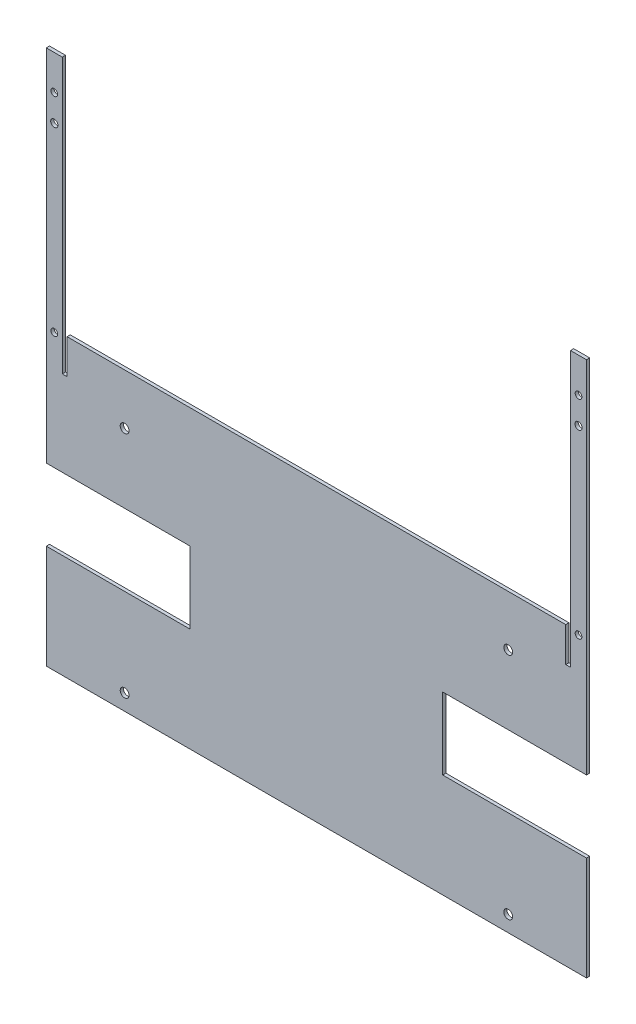
ISO-10303-21;
HEADER;
FILE_DESCRIPTION(('STEP AP214'),'2;1');
FILE_NAME('part.step','',(''),(''),'','','');
FILE_SCHEMA(('AUTOMOTIVE_DESIGN { 1 0 10303 214 1 1 1 1 }'));
ENDSEC;
DATA;
#1=APPLICATION_CONTEXT('core data for automotive mechanical design processes');
#2=APPLICATION_PROTOCOL_DEFINITION('international standard','automotive_design',2000,#1);
#3=PRODUCT_CONTEXT('',#1,'mechanical');
#4=PRODUCT('Part','Part','',(#3));
#5=PRODUCT_RELATED_PRODUCT_CATEGORY('part','',(#4));
#6=PRODUCT_DEFINITION_FORMATION('','',#4);
#7=PRODUCT_DEFINITION_CONTEXT('part definition',#1,'design');
#8=PRODUCT_DEFINITION('design','',#6,#7);
#9=PRODUCT_DEFINITION_SHAPE('','',#8);
#10=(LENGTH_UNIT() NAMED_UNIT(*) SI_UNIT(.MILLI.,.METRE.));
#11=(NAMED_UNIT(*) PLANE_ANGLE_UNIT() SI_UNIT($,.RADIAN.));
#12=(NAMED_UNIT(*) SI_UNIT($,.STERADIAN.) SOLID_ANGLE_UNIT());
#13=UNCERTAINTY_MEASURE_WITH_UNIT(LENGTH_MEASURE(1.E-05),#10,'distance_accuracy_value','');
#14=(GEOMETRIC_REPRESENTATION_CONTEXT(3) GLOBAL_UNCERTAINTY_ASSIGNED_CONTEXT((#13)) GLOBAL_UNIT_ASSIGNED_CONTEXT((#10,
#11,#12)) REPRESENTATION_CONTEXT('',''));
#15=CARTESIAN_POINT('',(0.,0.,0.));
#16=DIRECTION('',(0.,0.,1.));
#17=DIRECTION('',(1.,0.,0.));
#18=AXIS2_PLACEMENT_3D('',#15,#16,#17);
#19=CARTESIAN_POINT('',(-169.,-167.5,2.));
#20=DIRECTION('',(1.,0.,0.));
#21=DIRECTION('',(0.,0.,-1.));
#22=AXIS2_PLACEMENT_3D('',#19,#20,#21);
#23=PLANE('',#22);
#24=DIRECTION('',(0.,-1.,0.));
#25=VECTOR('',#24,1.);
#26=CARTESIAN_POINT('',(-169.,-167.5,2.));
#27=LINE('',#26,#25);
#28=CARTESIAN_POINT('',(-169.,-102.5,2.));
#29=VERTEX_POINT('',#28);
#30=CARTESIAN_POINT('',(-169.,-167.5,2.));
#31=VERTEX_POINT('',#30);
#32=EDGE_CURVE('E310',#29,#31,#27,.T.);
#33=ORIENTED_EDGE('',*,*,#32,.F.);
#34=DIRECTION('',(0.,0.,1.));
#35=VECTOR('',#34,1.);
#36=CARTESIAN_POINT('',(-169.,-102.5,0.));
#37=LINE('',#36,#35);
#38=CARTESIAN_POINT('',(-169.,-102.5,0.));
#39=VERTEX_POINT('',#38);
#40=EDGE_CURVE('E250',#39,#29,#37,.T.);
#41=ORIENTED_EDGE('',*,*,#40,.F.);
#42=DIRECTION('',(0.,-1.,0.));
#43=VECTOR('',#42,1.);
#44=CARTESIAN_POINT('',(-169.,-167.5,0.));
#45=LINE('',#44,#43);
#46=CARTESIAN_POINT('',(-169.,-167.5,0.));
#47=VERTEX_POINT('',#46);
#48=EDGE_CURVE('E324',#39,#47,#45,.T.);
#49=ORIENTED_EDGE('',*,*,#48,.T.);
#50=DIRECTION('',(0.,0.,-1.));
#51=VECTOR('',#50,1.);
#52=CARTESIAN_POINT('',(-169.,-167.5,2.));
#53=LINE('',#52,#51);
#54=EDGE_CURVE('E332',#31,#47,#53,.T.);
#55=ORIENTED_EDGE('',*,*,#54,.F.);
#56=EDGE_LOOP('',(#33,#41,#49,#55));
#57=FACE_BOUND('',#56,.T.);
#58=ADVANCED_FACE('F33',(#57),#23,.F.);
#59=CARTESIAN_POINT('',(-169.,167.5,2.));
#60=DIRECTION('',(0.,-1.,0.));
#61=DIRECTION('',(0.,0.,-1.));
#62=AXIS2_PLACEMENT_3D('',#59,#60,#61);
#63=PLANE('',#62);
#64=DIRECTION('',(-1.,0.,0.));
#65=VECTOR('',#64,1.);
#66=CARTESIAN_POINT('',(-169.,167.5,0.));
#67=LINE('',#66,#65);
#68=CARTESIAN_POINT('',(169.,167.5,0.));
#69=VERTEX_POINT('',#68);
#70=CARTESIAN_POINT('',(159.,167.5,0.));
#71=VERTEX_POINT('',#70);
#72=EDGE_CURVE('E321',#69,#71,#67,.T.);
#73=ORIENTED_EDGE('',*,*,#72,.T.);
#74=DIRECTION('',(0.,0.,1.));
#75=VECTOR('',#74,1.);
#76=CARTESIAN_POINT('',(159.,167.5,0.));
#77=LINE('',#76,#75);
#78=CARTESIAN_POINT('',(159.,167.5,2.));
#79=VERTEX_POINT('',#78);
#80=EDGE_CURVE('E265',#71,#79,#77,.T.);
#81=ORIENTED_EDGE('',*,*,#80,.T.);
#82=DIRECTION('',(-1.,0.,0.));
#83=VECTOR('',#82,1.);
#84=CARTESIAN_POINT('',(-169.,167.5,2.));
#85=LINE('',#84,#83);
#86=CARTESIAN_POINT('',(169.,167.5,2.));
#87=VERTEX_POINT('',#86);
#88=EDGE_CURVE('E307',#87,#79,#85,.T.);
#89=ORIENTED_EDGE('',*,*,#88,.F.);
#90=DIRECTION('',(0.,0.,-1.));
#91=VECTOR('',#90,1.);
#92=CARTESIAN_POINT('',(169.,167.5,2.));
#93=LINE('',#92,#91);
#94=EDGE_CURVE('E11',#87,#69,#93,.T.);
#95=ORIENTED_EDGE('',*,*,#94,.T.);
#96=EDGE_LOOP('',(#73,#81,#89,#95));
#97=FACE_BOUND('',#96,.T.);
#98=ADVANCED_FACE('F375',(#97),#63,.F.);
#99=CARTESIAN_POINT('',(169.,-167.5,2.));
#100=DIRECTION('',(-1.,0.,0.));
#101=DIRECTION('',(0.,0.,1.));
#102=AXIS2_PLACEMENT_3D('',#99,#100,#101);
#103=PLANE('',#102);
#104=DIRECTION('',(0.,1.,0.));
#105=VECTOR('',#104,1.);
#106=CARTESIAN_POINT('',(169.,-167.5,0.));
#107=LINE('',#106,#105);
#108=CARTESIAN_POINT('',(169.,-167.5,0.));
#109=VERTEX_POINT('',#108);
#110=CARTESIAN_POINT('',(169.,-102.5,0.));
#111=VERTEX_POINT('',#110);
#112=EDGE_CURVE('E317',#109,#111,#107,.T.);
#113=ORIENTED_EDGE('',*,*,#112,.T.);
#114=DIRECTION('',(0.,0.,1.));
#115=VECTOR('',#114,1.);
#116=CARTESIAN_POINT('',(169.,-102.5,0.));
#117=LINE('',#116,#115);
#118=CARTESIAN_POINT('',(169.,-102.5,2.));
#119=VERTEX_POINT('',#118);
#120=EDGE_CURVE('E293',#111,#119,#117,.T.);
#121=ORIENTED_EDGE('',*,*,#120,.T.);
#122=DIRECTION('',(0.,1.,0.));
#123=VECTOR('',#122,1.);
#124=CARTESIAN_POINT('',(169.,-167.5,2.));
#125=LINE('',#124,#123);
#126=CARTESIAN_POINT('',(169.,-167.5,2.));
#127=VERTEX_POINT('',#126);
#128=EDGE_CURVE('E302',#127,#119,#125,.T.);
#129=ORIENTED_EDGE('',*,*,#128,.F.);
#130=DIRECTION('',(0.,0.,-1.));
#131=VECTOR('',#130,1.);
#132=CARTESIAN_POINT('',(169.,-167.5,2.));
#133=LINE('',#132,#131);
#134=EDGE_CURVE('E316',#127,#109,#133,.T.);
#135=ORIENTED_EDGE('',*,*,#134,.T.);
#136=EDGE_LOOP('',(#113,#121,#129,#135));
#137=FACE_BOUND('',#136,.T.);
#138=ADVANCED_FACE('F394',(#137),#103,.F.);
#139=CARTESIAN_POINT('',(169.,-57.5,2.));
#140=VERTEX_POINT('',#139);
#141=EDGE_CURVE('E306',#140,#87,#125,.T.);
#142=ORIENTED_EDGE('',*,*,#141,.F.);
#143=DIRECTION('',(0.,0.,1.));
#144=VECTOR('',#143,1.);
#145=CARTESIAN_POINT('',(169.,-57.5,0.));
#146=LINE('',#145,#144);
#147=CARTESIAN_POINT('',(169.,-57.5,0.));
#148=VERTEX_POINT('',#147);
#149=EDGE_CURVE('E286',#148,#140,#146,.T.);
#150=ORIENTED_EDGE('',*,*,#149,.F.);
#151=EDGE_CURVE('E296',#148,#69,#107,.T.);
#152=ORIENTED_EDGE('',*,*,#151,.T.);
#153=ORIENTED_EDGE('',*,*,#94,.F.);
#154=EDGE_LOOP('',(#142,#150,#152,#153));
#155=FACE_BOUND('',#154,.T.);
#156=ADVANCED_FACE('F35',(#155),#103,.F.);
#157=CARTESIAN_POINT('',(-159.,167.5,2.));
#158=VERTEX_POINT('',#157);
#159=CARTESIAN_POINT('',(-169.,167.5,2.));
#160=VERTEX_POINT('',#159);
#161=EDGE_CURVE('E305',#158,#160,#85,.T.);
#162=ORIENTED_EDGE('',*,*,#161,.F.);
#163=DIRECTION('',(0.,0.,1.));
#164=VECTOR('',#163,1.);
#165=CARTESIAN_POINT('',(-159.,167.5,0.));
#166=LINE('',#165,#164);
#167=CARTESIAN_POINT('',(-159.,167.5,0.));
#168=VERTEX_POINT('',#167);
#169=EDGE_CURVE('E271',#168,#158,#166,.T.);
#170=ORIENTED_EDGE('',*,*,#169,.F.);
#171=CARTESIAN_POINT('',(-169.,167.5,0.));
#172=VERTEX_POINT('',#171);
#173=EDGE_CURVE('E320',#168,#172,#67,.T.);
#174=ORIENTED_EDGE('',*,*,#173,.T.);
#175=DIRECTION('',(0.,0.,-1.));
#176=VECTOR('',#175,1.);
#177=CARTESIAN_POINT('',(-169.,167.5,2.));
#178=LINE('',#177,#176);
#179=EDGE_CURVE('E41',#160,#172,#178,.T.);
#180=ORIENTED_EDGE('',*,*,#179,.F.);
#181=EDGE_LOOP('',(#162,#170,#174,#180));
#182=FACE_BOUND('',#181,.T.);
#183=ADVANCED_FACE('F355',(#182),#63,.F.);
#184=CARTESIAN_POINT('',(-169.,-57.5,0.));
#185=VERTEX_POINT('',#184);
#186=EDGE_CURVE('E325',#172,#185,#45,.T.);
#187=ORIENTED_EDGE('',*,*,#186,.T.);
#188=DIRECTION('',(0.,0.,1.));
#189=VECTOR('',#188,1.);
#190=CARTESIAN_POINT('',(-169.,-57.5,0.));
#191=LINE('',#190,#189);
#192=CARTESIAN_POINT('',(-169.,-57.5,2.));
#193=VERTEX_POINT('',#192);
#194=EDGE_CURVE('E253',#185,#193,#191,.T.);
#195=ORIENTED_EDGE('',*,*,#194,.T.);
#196=EDGE_CURVE('E311',#160,#193,#27,.T.);
#197=ORIENTED_EDGE('',*,*,#196,.F.);
#198=ORIENTED_EDGE('',*,*,#179,.T.);
#199=EDGE_LOOP('',(#187,#195,#197,#198));
#200=FACE_BOUND('',#199,.T.);
#201=ADVANCED_FACE('F339',(#200),#23,.F.);
#202=CARTESIAN_POINT('',(-169.,-167.5,2.));
#203=DIRECTION('',(0.,1.,0.));
#204=DIRECTION('',(0.,0.,1.));
#205=AXIS2_PLACEMENT_3D('',#202,#203,#204);
#206=PLANE('',#205);
#207=DIRECTION('',(1.,0.,0.));
#208=VECTOR('',#207,1.);
#209=CARTESIAN_POINT('',(-169.,-167.5,0.));
#210=LINE('',#209,#208);
#211=EDGE_CURVE('E328',#47,#109,#210,.T.);
#212=ORIENTED_EDGE('',*,*,#211,.T.);
#213=ORIENTED_EDGE('',*,*,#134,.F.);
#214=DIRECTION('',(1.,0.,0.));
#215=VECTOR('',#214,1.);
#216=CARTESIAN_POINT('',(-169.,-167.5,2.));
#217=LINE('',#216,#215);
#218=EDGE_CURVE('E314',#31,#127,#217,.T.);
#219=ORIENTED_EDGE('',*,*,#218,.F.);
#220=ORIENTED_EDGE('',*,*,#54,.T.);
#221=EDGE_LOOP('',(#212,#213,#219,#220));
#222=FACE_BOUND('',#221,.T.);
#223=ADVANCED_FACE('F399',(#222),#206,.F.);
#224=CARTESIAN_POINT('',(0.,0.,2.));
#225=DIRECTION('',(0.,0.,-1.));
#226=DIRECTION('',(-1.,0.,0.));
#227=AXIS2_PLACEMENT_3D('',#224,#225,#226);
#228=PLANE('',#227);
#229=CARTESIAN_POINT('',(120.,-157.5,2.));
#230=DIRECTION('',(0.,0.,1.));
#231=DIRECTION('',(-1.,0.,0.));
#232=AXIS2_PLACEMENT_3D('',#229,#230,#231);
#233=CIRCLE('',#232,2.75000000000001);
#234=CARTESIAN_POINT('',(117.25,-157.5,2.));
#235=VERTEX_POINT('',#234);
#236=EDGE_CURVE('E688',#235,#235,#233,.T.);
#237=ORIENTED_EDGE('',*,*,#236,.F.);
#238=EDGE_LOOP('',(#237));
#239=FACE_BOUND('',#238,.T.);
#240=CARTESIAN_POINT('',(120.,-14.17,2.));
#241=DIRECTION('',(0.,0.,1.));
#242=DIRECTION('',(-1.,0.,0.));
#243=AXIS2_PLACEMENT_3D('',#240,#241,#242);
#244=CIRCLE('',#243,2.75000000000001);
#245=CARTESIAN_POINT('',(117.25,-14.17,2.));
#246=VERTEX_POINT('',#245);
#247=EDGE_CURVE('E690',#246,#246,#244,.T.);
#248=ORIENTED_EDGE('',*,*,#247,.F.);
#249=EDGE_LOOP('',(#248));
#250=FACE_BOUND('',#249,.T.);
#251=CARTESIAN_POINT('',(-120.,-14.17,2.));
#252=DIRECTION('',(0.,0.,1.));
#253=DIRECTION('',(1.,0.,0.));
#254=AXIS2_PLACEMENT_3D('',#251,#252,#253);
#255=CIRCLE('',#254,2.75000000000001);
#256=CARTESIAN_POINT('',(-117.25,-14.17,2.));
#257=VERTEX_POINT('',#256);
#258=EDGE_CURVE('E696',#257,#257,#255,.T.);
#259=ORIENTED_EDGE('',*,*,#258,.F.);
#260=EDGE_LOOP('',(#259));
#261=FACE_BOUND('',#260,.T.);
#262=CARTESIAN_POINT('',(-120.,-157.5,2.));
#263=DIRECTION('',(0.,0.,1.));
#264=DIRECTION('',(1.,0.,0.));
#265=AXIS2_PLACEMENT_3D('',#262,#263,#264);
#266=CIRCLE('',#265,2.75000000000001);
#267=CARTESIAN_POINT('',(-117.25,-157.5,2.));
#268=VERTEX_POINT('',#267);
#269=EDGE_CURVE('E702',#268,#268,#266,.T.);
#270=ORIENTED_EDGE('',*,*,#269,.F.);
#271=EDGE_LOOP('',(#270));
#272=FACE_BOUND('',#271,.T.);
#273=CARTESIAN_POINT('',(164.,145.83,2.));
#274=DIRECTION('',(0.,0.,1.));
#275=DIRECTION('',(-1.,0.,0.));
#276=AXIS2_PLACEMENT_3D('',#273,#274,#275);
#277=CIRCLE('',#276,2.09999999999999);
#278=CARTESIAN_POINT('',(161.9,145.83,2.));
#279=VERTEX_POINT('',#278);
#280=EDGE_CURVE('E708',#279,#279,#277,.T.);
#281=ORIENTED_EDGE('',*,*,#280,.F.);
#282=EDGE_LOOP('',(#281));
#283=FACE_BOUND('',#282,.T.);
#284=CARTESIAN_POINT('',(164.,15.8300000000001,2.));
#285=DIRECTION('',(0.,0.,1.));
#286=DIRECTION('',(-1.,0.,0.));
#287=AXIS2_PLACEMENT_3D('',#284,#285,#286);
#288=CIRCLE('',#287,2.09999999999999);
#289=CARTESIAN_POINT('',(161.9,15.8300000000001,2.));
#290=VERTEX_POINT('',#289);
#291=EDGE_CURVE('E714',#290,#290,#288,.T.);
#292=ORIENTED_EDGE('',*,*,#291,.F.);
#293=EDGE_LOOP('',(#292));
#294=FACE_BOUND('',#293,.T.);
#295=CARTESIAN_POINT('',(-164.,145.83,2.));
#296=DIRECTION('',(0.,0.,1.));
#297=DIRECTION('',(1.,0.,0.));
#298=AXIS2_PLACEMENT_3D('',#295,#296,#297);
#299=CIRCLE('',#298,2.09999999999999);
#300=CARTESIAN_POINT('',(-161.9,145.83,2.));
#301=VERTEX_POINT('',#300);
#302=EDGE_CURVE('E720',#301,#301,#299,.T.);
#303=ORIENTED_EDGE('',*,*,#302,.F.);
#304=EDGE_LOOP('',(#303));
#305=FACE_BOUND('',#304,.T.);
#306=CARTESIAN_POINT('',(-164.,15.83,2.));
#307=DIRECTION('',(0.,0.,1.));
#308=DIRECTION('',(1.,0.,0.));
#309=AXIS2_PLACEMENT_3D('',#306,#307,#308);
#310=CIRCLE('',#309,2.09999999999999);
#311=CARTESIAN_POINT('',(-161.9,15.83,2.));
#312=VERTEX_POINT('',#311);
#313=EDGE_CURVE('E197',#312,#312,#310,.T.);
#314=ORIENTED_EDGE('',*,*,#313,.F.);
#315=EDGE_LOOP('',(#314));
#316=FACE_BOUND('',#315,.T.);
#317=CARTESIAN_POINT('',(164.,129.17,2.));
#318=DIRECTION('',(0.,0.,1.));
#319=DIRECTION('',(1.,0.,0.));
#320=AXIS2_PLACEMENT_3D('',#317,#318,#319);
#321=CIRCLE('',#320,2.25);
#322=CARTESIAN_POINT('',(166.25,129.17,2.));
#323=VERTEX_POINT('',#322);
#324=EDGE_CURVE('E218',#323,#323,#321,.T.);
#325=ORIENTED_EDGE('',*,*,#324,.F.);
#326=EDGE_LOOP('',(#325));
#327=FACE_BOUND('',#326,.T.);
#328=CARTESIAN_POINT('',(-164.,129.17,2.));
#329=DIRECTION('',(0.,0.,1.));
#330=DIRECTION('',(1.,0.,0.));
#331=AXIS2_PLACEMENT_3D('',#328,#329,#330);
#332=CIRCLE('',#331,2.24999999999997);
#333=CARTESIAN_POINT('',(-161.75,129.17,2.));
#334=VERTEX_POINT('',#333);
#335=EDGE_CURVE('E228',#334,#334,#332,.T.);
#336=ORIENTED_EDGE('',*,*,#335,.F.);
#337=EDGE_LOOP('',(#336));
#338=FACE_BOUND('',#337,.T.);
#339=DIRECTION('',(0.,1.,0.));
#340=VECTOR('',#339,1.);
#341=CARTESIAN_POINT('',(159.,167.5,2.));
#342=LINE('',#341,#340);
#343=CARTESIAN_POINT('',(159.,-4.16999999999995,2.));
#344=VERTEX_POINT('',#343);
#345=EDGE_CURVE('E252',#344,#79,#342,.T.);
#346=ORIENTED_EDGE('',*,*,#345,.F.);
#347=DIRECTION('',(1.,0.,0.));
#348=VECTOR('',#347,1.);
#349=CARTESIAN_POINT('',(159.,-4.16999999999995,2.));
#350=LINE('',#349,#348);
#351=CARTESIAN_POINT('',(156.,-4.16999999999995,2.));
#352=VERTEX_POINT('',#351);
#353=EDGE_CURVE('E193',#352,#344,#350,.T.);
#354=ORIENTED_EDGE('',*,*,#353,.F.);
#355=DIRECTION('',(0.,-1.,0.));
#356=VECTOR('',#355,1.);
#357=CARTESIAN_POINT('',(156.,17.5000000000001,2.));
#358=LINE('',#357,#356);
#359=CARTESIAN_POINT('',(156.,17.5000000000001,2.));
#360=VERTEX_POINT('',#359);
#361=EDGE_CURVE('E172',#360,#352,#358,.T.);
#362=ORIENTED_EDGE('',*,*,#361,.F.);
#363=DIRECTION('',(1.,0.,0.));
#364=VECTOR('',#363,1.);
#365=CARTESIAN_POINT('',(-159.,17.5,2.));
#366=LINE('',#365,#364);
#367=CARTESIAN_POINT('',(-156.,17.5,2.));
#368=VERTEX_POINT('',#367);
#369=EDGE_CURVE('E262',#368,#360,#366,.T.);
#370=ORIENTED_EDGE('',*,*,#369,.F.);
#371=DIRECTION('',(0.,1.,0.));
#372=VECTOR('',#371,1.);
#373=CARTESIAN_POINT('',(-156.,17.5,2.));
#374=LINE('',#373,#372);
#375=CARTESIAN_POINT('',(-156.,-4.16999999999999,2.));
#376=VERTEX_POINT('',#375);
#377=EDGE_CURVE('E209',#376,#368,#374,.T.);
#378=ORIENTED_EDGE('',*,*,#377,.F.);
#379=DIRECTION('',(1.,0.,0.));
#380=VECTOR('',#379,1.);
#381=CARTESIAN_POINT('',(-159.,-4.16999999999999,2.));
#382=LINE('',#381,#380);
#383=CARTESIAN_POINT('',(-159.,-4.16999999999999,2.));
#384=VERTEX_POINT('',#383);
#385=EDGE_CURVE('E202',#384,#376,#382,.T.);
#386=ORIENTED_EDGE('',*,*,#385,.F.);
#387=DIRECTION('',(0.,-1.,0.));
#388=VECTOR('',#387,1.);
#389=CARTESIAN_POINT('',(-159.,167.5,2.));
#390=LINE('',#389,#388);
#391=EDGE_CURVE('E267',#158,#384,#390,.T.);
#392=ORIENTED_EDGE('',*,*,#391,.F.);
#393=ORIENTED_EDGE('',*,*,#161,.T.);
#394=ORIENTED_EDGE('',*,*,#196,.T.);
#395=DIRECTION('',(-1.,0.,0.));
#396=VECTOR('',#395,1.);
#397=CARTESIAN_POINT('',(-169.,-57.5,2.));
#398=LINE('',#397,#396);
#399=CARTESIAN_POINT('',(-79.,-57.5,2.));
#400=VERTEX_POINT('',#399);
#401=EDGE_CURVE('E239',#400,#193,#398,.T.);
#402=ORIENTED_EDGE('',*,*,#401,.F.);
#403=DIRECTION('',(0.,1.,0.));
#404=VECTOR('',#403,1.);
#405=CARTESIAN_POINT('',(-79.,-102.5,2.));
#406=LINE('',#405,#404);
#407=CARTESIAN_POINT('',(-79.,-102.5,2.));
#408=VERTEX_POINT('',#407);
#409=EDGE_CURVE('E246',#408,#400,#406,.T.);
#410=ORIENTED_EDGE('',*,*,#409,.F.);
#411=DIRECTION('',(1.,0.,0.));
#412=VECTOR('',#411,1.);
#413=CARTESIAN_POINT('',(-169.,-102.5,2.));
#414=LINE('',#413,#412);
#415=EDGE_CURVE('E234',#29,#408,#414,.T.);
#416=ORIENTED_EDGE('',*,*,#415,.F.);
#417=ORIENTED_EDGE('',*,*,#32,.T.);
#418=ORIENTED_EDGE('',*,*,#218,.T.);
#419=ORIENTED_EDGE('',*,*,#128,.T.);
#420=DIRECTION('',(1.,0.,0.));
#421=VECTOR('',#420,1.);
#422=CARTESIAN_POINT('',(169.,-102.5,2.));
#423=LINE('',#422,#421);
#424=CARTESIAN_POINT('',(79.,-102.5,2.));
#425=VERTEX_POINT('',#424);
#426=EDGE_CURVE('E280',#425,#119,#423,.T.);
#427=ORIENTED_EDGE('',*,*,#426,.F.);
#428=DIRECTION('',(0.,-1.,0.));
#429=VECTOR('',#428,1.);
#430=CARTESIAN_POINT('',(79.,-102.5,2.));
#431=LINE('',#430,#429);
#432=CARTESIAN_POINT('',(79.,-57.5,2.));
#433=VERTEX_POINT('',#432);
#434=EDGE_CURVE('E289',#433,#425,#431,.T.);
#435=ORIENTED_EDGE('',*,*,#434,.F.);
#436=DIRECTION('',(-1.,0.,0.));
#437=VECTOR('',#436,1.);
#438=CARTESIAN_POINT('',(169.,-57.5,2.));
#439=LINE('',#438,#437);
#440=EDGE_CURVE('E273',#140,#433,#439,.T.);
#441=ORIENTED_EDGE('',*,*,#440,.F.);
#442=ORIENTED_EDGE('',*,*,#141,.T.);
#443=ORIENTED_EDGE('',*,*,#88,.T.);
#444=EDGE_LOOP('',(#346,#354,#362,#370,#378,#386,#392,#393,#394,#402,#410,#416,#417,#418,#419,
#427,#435,#441,#442,#443));
#445=FACE_BOUND('',#444,.T.);
#446=ADVANCED_FACE('F351',(#239,#250,#261,#272,#283,#294,#305,#316,#327,#338,#445),#228,.F.);
#447=CARTESIAN_POINT('',(0.,0.,0.));
#448=DIRECTION('',(0.,0.,-1.));
#449=DIRECTION('',(-1.,0.,0.));
#450=AXIS2_PLACEMENT_3D('',#447,#448,#449);
#451=PLANE('',#450);
#452=CARTESIAN_POINT('',(120.,-157.5,0.));
#453=DIRECTION('',(0.,0.,1.));
#454=DIRECTION('',(-1.,0.,0.));
#455=AXIS2_PLACEMENT_3D('',#452,#453,#454);
#456=CIRCLE('',#455,2.75000000000001);
#457=CARTESIAN_POINT('',(117.25,-157.5,0.));
#458=VERTEX_POINT('',#457);
#459=EDGE_CURVE('E685',#458,#458,#456,.T.);
#460=ORIENTED_EDGE('',*,*,#459,.T.);
#461=EDGE_LOOP('',(#460));
#462=FACE_BOUND('',#461,.T.);
#463=CARTESIAN_POINT('',(120.,-14.17,0.));
#464=DIRECTION('',(0.,0.,1.));
#465=DIRECTION('',(-1.,0.,0.));
#466=AXIS2_PLACEMENT_3D('',#463,#464,#465);
#467=CIRCLE('',#466,2.75000000000001);
#468=CARTESIAN_POINT('',(117.25,-14.17,0.));
#469=VERTEX_POINT('',#468);
#470=EDGE_CURVE('E693',#469,#469,#467,.T.);
#471=ORIENTED_EDGE('',*,*,#470,.T.);
#472=EDGE_LOOP('',(#471));
#473=FACE_BOUND('',#472,.T.);
#474=CARTESIAN_POINT('',(-120.,-14.17,0.));
#475=DIRECTION('',(0.,0.,1.));
#476=DIRECTION('',(1.,0.,0.));
#477=AXIS2_PLACEMENT_3D('',#474,#475,#476);
#478=CIRCLE('',#477,2.75000000000001);
#479=CARTESIAN_POINT('',(-117.25,-14.17,0.));
#480=VERTEX_POINT('',#479);
#481=EDGE_CURVE('E699',#480,#480,#478,.T.);
#482=ORIENTED_EDGE('',*,*,#481,.T.);
#483=EDGE_LOOP('',(#482));
#484=FACE_BOUND('',#483,.T.);
#485=CARTESIAN_POINT('',(-120.,-157.5,0.));
#486=DIRECTION('',(0.,0.,1.));
#487=DIRECTION('',(1.,0.,0.));
#488=AXIS2_PLACEMENT_3D('',#485,#486,#487);
#489=CIRCLE('',#488,2.75000000000001);
#490=CARTESIAN_POINT('',(-117.25,-157.5,0.));
#491=VERTEX_POINT('',#490);
#492=EDGE_CURVE('E705',#491,#491,#489,.T.);
#493=ORIENTED_EDGE('',*,*,#492,.T.);
#494=EDGE_LOOP('',(#493));
#495=FACE_BOUND('',#494,.T.);
#496=CARTESIAN_POINT('',(164.,145.83,0.));
#497=DIRECTION('',(0.,0.,1.));
#498=DIRECTION('',(-1.,0.,0.));
#499=AXIS2_PLACEMENT_3D('',#496,#497,#498);
#500=CIRCLE('',#499,2.09999999999999);
#501=CARTESIAN_POINT('',(161.9,145.83,0.));
#502=VERTEX_POINT('',#501);
#503=EDGE_CURVE('E711',#502,#502,#500,.T.);
#504=ORIENTED_EDGE('',*,*,#503,.T.);
#505=EDGE_LOOP('',(#504));
#506=FACE_BOUND('',#505,.T.);
#507=CARTESIAN_POINT('',(164.,15.8300000000001,0.));
#508=DIRECTION('',(0.,0.,1.));
#509=DIRECTION('',(-1.,0.,0.));
#510=AXIS2_PLACEMENT_3D('',#507,#508,#509);
#511=CIRCLE('',#510,2.09999999999999);
#512=CARTESIAN_POINT('',(161.9,15.8300000000001,0.));
#513=VERTEX_POINT('',#512);
#514=EDGE_CURVE('E717',#513,#513,#511,.T.);
#515=ORIENTED_EDGE('',*,*,#514,.T.);
#516=EDGE_LOOP('',(#515));
#517=FACE_BOUND('',#516,.T.);
#518=CARTESIAN_POINT('',(-164.,145.83,0.));
#519=DIRECTION('',(0.,0.,1.));
#520=DIRECTION('',(1.,0.,0.));
#521=AXIS2_PLACEMENT_3D('',#518,#519,#520);
#522=CIRCLE('',#521,2.09999999999999);
#523=CARTESIAN_POINT('',(-161.9,145.83,0.));
#524=VERTEX_POINT('',#523);
#525=EDGE_CURVE('E723',#524,#524,#522,.T.);
#526=ORIENTED_EDGE('',*,*,#525,.T.);
#527=EDGE_LOOP('',(#526));
#528=FACE_BOUND('',#527,.T.);
#529=CARTESIAN_POINT('',(-164.,15.83,0.));
#530=DIRECTION('',(0.,0.,1.));
#531=DIRECTION('',(1.,0.,0.));
#532=AXIS2_PLACEMENT_3D('',#529,#530,#531);
#533=CIRCLE('',#532,2.09999999999999);
#534=CARTESIAN_POINT('',(-161.9,15.83,0.));
#535=VERTEX_POINT('',#534);
#536=EDGE_CURVE('E200',#535,#535,#533,.T.);
#537=ORIENTED_EDGE('',*,*,#536,.T.);
#538=EDGE_LOOP('',(#537));
#539=FACE_BOUND('',#538,.T.);
#540=DIRECTION('',(1.,0.,0.));
#541=VECTOR('',#540,1.);
#542=CARTESIAN_POINT('',(159.,-4.16999999999995,0.));
#543=LINE('',#542,#541);
#544=CARTESIAN_POINT('',(156.,-4.16999999999995,0.));
#545=VERTEX_POINT('',#544);
#546=CARTESIAN_POINT('',(159.,-4.16999999999995,0.));
#547=VERTEX_POINT('',#546);
#548=EDGE_CURVE('E181',#545,#547,#543,.T.);
#549=ORIENTED_EDGE('',*,*,#548,.T.);
#550=DIRECTION('',(0.,1.,0.));
#551=VECTOR('',#550,1.);
#552=CARTESIAN_POINT('',(159.,167.5,0.));
#553=LINE('',#552,#551);
#554=EDGE_CURVE('E259',#547,#71,#553,.T.);
#555=ORIENTED_EDGE('',*,*,#554,.T.);
#556=ORIENTED_EDGE('',*,*,#72,.F.);
#557=ORIENTED_EDGE('',*,*,#151,.F.);
#558=DIRECTION('',(-1.,0.,0.));
#559=VECTOR('',#558,1.);
#560=CARTESIAN_POINT('',(169.,-57.5,0.));
#561=LINE('',#560,#559);
#562=CARTESIAN_POINT('',(79.,-57.5,0.));
#563=VERTEX_POINT('',#562);
#564=EDGE_CURVE('E276',#148,#563,#561,.T.);
#565=ORIENTED_EDGE('',*,*,#564,.T.);
#566=DIRECTION('',(0.,-1.,0.));
#567=VECTOR('',#566,1.);
#568=CARTESIAN_POINT('',(79.,-102.5,0.));
#569=LINE('',#568,#567);
#570=CARTESIAN_POINT('',(79.,-102.5,0.));
#571=VERTEX_POINT('',#570);
#572=EDGE_CURVE('E279',#563,#571,#569,.T.);
#573=ORIENTED_EDGE('',*,*,#572,.T.);
#574=DIRECTION('',(1.,0.,0.));
#575=VECTOR('',#574,1.);
#576=CARTESIAN_POINT('',(169.,-102.5,0.));
#577=LINE('',#576,#575);
#578=EDGE_CURVE('E283',#571,#111,#577,.T.);
#579=ORIENTED_EDGE('',*,*,#578,.T.);
#580=ORIENTED_EDGE('',*,*,#112,.F.);
#581=ORIENTED_EDGE('',*,*,#211,.F.);
#582=ORIENTED_EDGE('',*,*,#48,.F.);
#583=DIRECTION('',(1.,0.,0.));
#584=VECTOR('',#583,1.);
#585=CARTESIAN_POINT('',(-169.,-102.5,0.));
#586=LINE('',#585,#584);
#587=CARTESIAN_POINT('',(-79.,-102.5,0.));
#588=VERTEX_POINT('',#587);
#589=EDGE_CURVE('E235',#39,#588,#586,.T.);
#590=ORIENTED_EDGE('',*,*,#589,.T.);
#591=DIRECTION('',(0.,1.,0.));
#592=VECTOR('',#591,1.);
#593=CARTESIAN_POINT('',(-79.,-102.5,0.));
#594=LINE('',#593,#592);
#595=CARTESIAN_POINT('',(-79.,-57.5,0.));
#596=VERTEX_POINT('',#595);
#597=EDGE_CURVE('E238',#588,#596,#594,.T.);
#598=ORIENTED_EDGE('',*,*,#597,.T.);
#599=DIRECTION('',(-1.,0.,0.));
#600=VECTOR('',#599,1.);
#601=CARTESIAN_POINT('',(-169.,-57.5,0.));
#602=LINE('',#601,#600);
#603=EDGE_CURVE('E56',#596,#185,#602,.T.);
#604=ORIENTED_EDGE('',*,*,#603,.T.);
#605=ORIENTED_EDGE('',*,*,#186,.F.);
#606=ORIENTED_EDGE('',*,*,#173,.F.);
#607=DIRECTION('',(0.,-1.,0.));
#608=VECTOR('',#607,1.);
#609=CARTESIAN_POINT('',(-159.,167.5,0.));
#610=LINE('',#609,#608);
#611=CARTESIAN_POINT('',(-159.,-4.16999999999999,0.));
#612=VERTEX_POINT('',#611);
#613=EDGE_CURVE('E261',#168,#612,#610,.T.);
#614=ORIENTED_EDGE('',*,*,#613,.T.);
#615=DIRECTION('',(1.,0.,0.));
#616=VECTOR('',#615,1.);
#617=CARTESIAN_POINT('',(-159.,-4.16999999999999,0.));
#618=LINE('',#617,#616);
#619=CARTESIAN_POINT('',(-156.,-4.16999999999999,0.));
#620=VERTEX_POINT('',#619);
#621=EDGE_CURVE('E205',#612,#620,#618,.T.);
#622=ORIENTED_EDGE('',*,*,#621,.T.);
#623=DIRECTION('',(0.,1.,0.));
#624=VECTOR('',#623,1.);
#625=CARTESIAN_POINT('',(-156.,17.5,0.));
#626=LINE('',#625,#624);
#627=CARTESIAN_POINT('',(-156.,17.5,0.));
#628=VERTEX_POINT('',#627);
#629=EDGE_CURVE('E208',#620,#628,#626,.T.);
#630=ORIENTED_EDGE('',*,*,#629,.T.);
#631=DIRECTION('',(1.,0.,0.));
#632=VECTOR('',#631,1.);
#633=CARTESIAN_POINT('',(-159.,17.5,0.));
#634=LINE('',#633,#632);
#635=CARTESIAN_POINT('',(156.,17.5,0.));
#636=VERTEX_POINT('',#635);
#637=EDGE_CURVE('E192',#628,#636,#634,.T.);
#638=ORIENTED_EDGE('',*,*,#637,.T.);
#639=DIRECTION('',(0.,-1.,0.));
#640=VECTOR('',#639,1.);
#641=CARTESIAN_POINT('',(156.,17.5000000000001,0.));
#642=LINE('',#641,#640);
#643=EDGE_CURVE('E48',#636,#545,#642,.T.);
#644=ORIENTED_EDGE('',*,*,#643,.T.);
#645=EDGE_LOOP('',(#549,#555,#556,#557,#565,#573,#579,#580,#581,#582,#590,#598,#604,#605,#606,
#614,#622,#630,#638,#644));
#646=FACE_BOUND('',#645,.T.);
#647=CARTESIAN_POINT('',(164.,129.17,0.));
#648=DIRECTION('',(0.,0.,1.));
#649=DIRECTION('',(1.,0.,0.));
#650=AXIS2_PLACEMENT_3D('',#647,#648,#649);
#651=CIRCLE('',#650,2.25);
#652=CARTESIAN_POINT('',(166.25,129.17,0.));
#653=VERTEX_POINT('',#652);
#654=EDGE_CURVE('E225',#653,#653,#651,.T.);
#655=ORIENTED_EDGE('',*,*,#654,.T.);
#656=EDGE_LOOP('',(#655));
#657=FACE_BOUND('',#656,.T.);
#658=CARTESIAN_POINT('',(-164.,129.17,0.));
#659=DIRECTION('',(0.,0.,1.));
#660=DIRECTION('',(1.,0.,0.));
#661=AXIS2_PLACEMENT_3D('',#658,#659,#660);
#662=CIRCLE('',#661,2.25);
#663=CARTESIAN_POINT('',(-161.75,129.17,0.));
#664=VERTEX_POINT('',#663);
#665=EDGE_CURVE('E231',#664,#664,#662,.T.);
#666=ORIENTED_EDGE('',*,*,#665,.T.);
#667=EDGE_LOOP('',(#666));
#668=FACE_BOUND('',#667,.T.);
#669=ADVANCED_FACE('F188',(#462,#473,#484,#495,#506,#517,#528,#539,#646,#657,#668),#451,.T.);
#670=CARTESIAN_POINT('',(169.,-102.5,0.));
#671=DIRECTION('',(0.,-1.,0.));
#672=DIRECTION('',(1.,0.,0.));
#673=AXIS2_PLACEMENT_3D('',#670,#671,#672);
#674=PLANE('',#673);
#675=ORIENTED_EDGE('',*,*,#426,.T.);
#676=ORIENTED_EDGE('',*,*,#120,.F.);
#677=ORIENTED_EDGE('',*,*,#578,.F.);
#678=DIRECTION('',(0.,0.,1.));
#679=VECTOR('',#678,1.);
#680=CARTESIAN_POINT('',(79.,-102.5,0.));
#681=LINE('',#680,#679);
#682=EDGE_CURVE('E297',#571,#425,#681,.T.);
#683=ORIENTED_EDGE('',*,*,#682,.T.);
#684=EDGE_LOOP('',(#675,#676,#677,#683));
#685=FACE_BOUND('',#684,.T.);
#686=ADVANCED_FACE('F390',(#685),#674,.F.);
#687=CARTESIAN_POINT('',(79.,-102.5,0.));
#688=DIRECTION('',(-1.,0.,0.));
#689=DIRECTION('',(0.,0.,1.));
#690=AXIS2_PLACEMENT_3D('',#687,#688,#689);
#691=PLANE('',#690);
#692=ORIENTED_EDGE('',*,*,#434,.T.);
#693=ORIENTED_EDGE('',*,*,#682,.F.);
#694=ORIENTED_EDGE('',*,*,#572,.F.);
#695=DIRECTION('',(0.,0.,1.));
#696=VECTOR('',#695,1.);
#697=CARTESIAN_POINT('',(79.,-57.5,0.));
#698=LINE('',#697,#696);
#699=EDGE_CURVE('E299',#563,#433,#698,.T.);
#700=ORIENTED_EDGE('',*,*,#699,.T.);
#701=EDGE_LOOP('',(#692,#693,#694,#700));
#702=FACE_BOUND('',#701,.T.);
#703=ADVANCED_FACE('F386',(#702),#691,.F.);
#704=CARTESIAN_POINT('',(169.,-57.5,0.));
#705=DIRECTION('',(0.,1.,0.));
#706=DIRECTION('',(-1.,0.,0.));
#707=AXIS2_PLACEMENT_3D('',#704,#705,#706);
#708=PLANE('',#707);
#709=ORIENTED_EDGE('',*,*,#440,.T.);
#710=ORIENTED_EDGE('',*,*,#699,.F.);
#711=ORIENTED_EDGE('',*,*,#564,.F.);
#712=ORIENTED_EDGE('',*,*,#149,.T.);
#713=EDGE_LOOP('',(#709,#710,#711,#712));
#714=FACE_BOUND('',#713,.T.);
#715=ADVANCED_FACE('F382',(#714),#708,.F.);
#716=CARTESIAN_POINT('',(159.,167.5,0.));
#717=DIRECTION('',(1.,0.,0.));
#718=DIRECTION('',(0.,1.,0.));
#719=AXIS2_PLACEMENT_3D('',#716,#717,#718);
#720=PLANE('',#719);
#721=ORIENTED_EDGE('',*,*,#345,.T.);
#722=ORIENTED_EDGE('',*,*,#80,.F.);
#723=ORIENTED_EDGE('',*,*,#554,.F.);
#724=DIRECTION('',(0.,0.,1.));
#725=VECTOR('',#724,1.);
#726=CARTESIAN_POINT('',(159.,-4.16999999999995,0.));
#727=LINE('',#726,#725);
#728=EDGE_CURVE('E176',#547,#344,#727,.T.);
#729=ORIENTED_EDGE('',*,*,#728,.T.);
#730=EDGE_LOOP('',(#721,#722,#723,#729));
#731=FACE_BOUND('',#730,.T.);
#732=ADVANCED_FACE('F371',(#731),#720,.F.);
#733=CARTESIAN_POINT('',(-159.,17.5,0.));
#734=DIRECTION('',(0.,-1.,0.));
#735=DIRECTION('',(0.,0.,-1.));
#736=AXIS2_PLACEMENT_3D('',#733,#734,#735);
#737=PLANE('',#736);
#738=ORIENTED_EDGE('',*,*,#369,.T.);
#739=DIRECTION('',(0.,0.,1.));
#740=VECTOR('',#739,1.);
#741=CARTESIAN_POINT('',(156.,17.5000000000001,0.));
#742=LINE('',#741,#740);
#743=EDGE_CURVE('E177',#636,#360,#742,.T.);
#744=ORIENTED_EDGE('',*,*,#743,.F.);
#745=ORIENTED_EDGE('',*,*,#637,.F.);
#746=DIRECTION('',(0.,0.,1.));
#747=VECTOR('',#746,1.);
#748=CARTESIAN_POINT('',(-156.,17.5,0.));
#749=LINE('',#748,#747);
#750=EDGE_CURVE('E215',#628,#368,#749,.T.);
#751=ORIENTED_EDGE('',*,*,#750,.T.);
#752=EDGE_LOOP('',(#738,#744,#745,#751));
#753=FACE_BOUND('',#752,.T.);
#754=ADVANCED_FACE('F368',(#753),#737,.F.);
#755=CARTESIAN_POINT('',(-159.,167.5,0.));
#756=DIRECTION('',(-1.,0.,0.));
#757=DIRECTION('',(0.,-1.,0.));
#758=AXIS2_PLACEMENT_3D('',#755,#756,#757);
#759=PLANE('',#758);
#760=ORIENTED_EDGE('',*,*,#391,.T.);
#761=DIRECTION('',(0.,0.,1.));
#762=VECTOR('',#761,1.);
#763=CARTESIAN_POINT('',(-159.,-4.16999999999999,0.));
#764=LINE('',#763,#762);
#765=EDGE_CURVE('E211',#612,#384,#764,.T.);
#766=ORIENTED_EDGE('',*,*,#765,.F.);
#767=ORIENTED_EDGE('',*,*,#613,.F.);
#768=ORIENTED_EDGE('',*,*,#169,.T.);
#769=EDGE_LOOP('',(#760,#766,#767,#768));
#770=FACE_BOUND('',#769,.T.);
#771=ADVANCED_FACE('F357',(#770),#759,.F.);
#772=CARTESIAN_POINT('',(-169.,-102.5,0.));
#773=DIRECTION('',(0.,-1.,0.));
#774=DIRECTION('',(1.,0.,0.));
#775=AXIS2_PLACEMENT_3D('',#772,#773,#774);
#776=PLANE('',#775);
#777=ORIENTED_EDGE('',*,*,#415,.T.);
#778=DIRECTION('',(0.,0.,1.));
#779=VECTOR('',#778,1.);
#780=CARTESIAN_POINT('',(-79.,-102.5,0.));
#781=LINE('',#780,#779);
#782=EDGE_CURVE('E243',#588,#408,#781,.T.);
#783=ORIENTED_EDGE('',*,*,#782,.F.);
#784=ORIENTED_EDGE('',*,*,#589,.F.);
#785=ORIENTED_EDGE('',*,*,#40,.T.);
#786=EDGE_LOOP('',(#777,#783,#784,#785));
#787=FACE_BOUND('',#786,.T.);
#788=ADVANCED_FACE('F406',(#787),#776,.F.);
#789=CARTESIAN_POINT('',(-169.,-57.5,0.));
#790=DIRECTION('',(0.,1.,0.));
#791=DIRECTION('',(-1.,0.,0.));
#792=AXIS2_PLACEMENT_3D('',#789,#790,#791);
#793=PLANE('',#792);
#794=ORIENTED_EDGE('',*,*,#401,.T.);
#795=ORIENTED_EDGE('',*,*,#194,.F.);
#796=ORIENTED_EDGE('',*,*,#603,.F.);
#797=DIRECTION('',(0.,0.,1.));
#798=VECTOR('',#797,1.);
#799=CARTESIAN_POINT('',(-79.,-57.5,0.));
#800=LINE('',#799,#798);
#801=EDGE_CURVE('E256',#596,#400,#800,.T.);
#802=ORIENTED_EDGE('',*,*,#801,.T.);
#803=EDGE_LOOP('',(#794,#795,#796,#802));
#804=FACE_BOUND('',#803,.T.);
#805=ADVANCED_FACE('F349',(#804),#793,.F.);
#806=CARTESIAN_POINT('',(-79.,-102.5,0.));
#807=DIRECTION('',(1.,0.,0.));
#808=DIRECTION('',(0.,0.,-1.));
#809=AXIS2_PLACEMENT_3D('',#806,#807,#808);
#810=PLANE('',#809);
#811=ORIENTED_EDGE('',*,*,#409,.T.);
#812=ORIENTED_EDGE('',*,*,#801,.F.);
#813=ORIENTED_EDGE('',*,*,#597,.F.);
#814=ORIENTED_EDGE('',*,*,#782,.T.);
#815=EDGE_LOOP('',(#811,#812,#813,#814));
#816=FACE_BOUND('',#815,.T.);
#817=ADVANCED_FACE('F346',(#816),#810,.F.);
#818=CARTESIAN_POINT('',(-164.,129.17,2.));
#819=DIRECTION('',(0.,0.,1.));
#820=DIRECTION('',(1.,0.,0.));
#821=AXIS2_PLACEMENT_3D('',#818,#819,#820);
#822=CYLINDRICAL_SURFACE('',#821,2.24999999999999);
#823=ORIENTED_EDGE('',*,*,#665,.F.);
#824=EDGE_LOOP('',(#823));
#825=FACE_BOUND('',#824,.T.);
#826=ORIENTED_EDGE('',*,*,#335,.T.);
#827=EDGE_LOOP('',(#826));
#828=FACE_BOUND('',#827,.T.);
#829=ADVANCED_FACE('F628',(#825,#828),#822,.F.);
#830=CARTESIAN_POINT('',(164.,129.17,2.));
#831=DIRECTION('',(0.,0.,1.));
#832=DIRECTION('',(1.,0.,0.));
#833=AXIS2_PLACEMENT_3D('',#830,#831,#832);
#834=CYLINDRICAL_SURFACE('',#833,2.25);
#835=ORIENTED_EDGE('',*,*,#654,.F.);
#836=EDGE_LOOP('',(#835));
#837=FACE_BOUND('',#836,.T.);
#838=ORIENTED_EDGE('',*,*,#324,.T.);
#839=EDGE_LOOP('',(#838));
#840=FACE_BOUND('',#839,.T.);
#841=ADVANCED_FACE('F517',(#837,#840),#834,.F.);
#842=CARTESIAN_POINT('',(-156.,17.5,0.));
#843=DIRECTION('',(1.,0.,0.));
#844=DIRECTION('',(0.,0.,-1.));
#845=AXIS2_PLACEMENT_3D('',#842,#843,#844);
#846=PLANE('',#845);
#847=ORIENTED_EDGE('',*,*,#377,.T.);
#848=ORIENTED_EDGE('',*,*,#750,.F.);
#849=ORIENTED_EDGE('',*,*,#629,.F.);
#850=DIRECTION('',(0.,0.,1.));
#851=VECTOR('',#850,1.);
#852=CARTESIAN_POINT('',(-156.,-4.16999999999999,0.));
#853=LINE('',#852,#851);
#854=EDGE_CURVE('E219',#620,#376,#853,.T.);
#855=ORIENTED_EDGE('',*,*,#854,.T.);
#856=EDGE_LOOP('',(#847,#848,#849,#855));
#857=FACE_BOUND('',#856,.T.);
#858=ADVANCED_FACE('F365',(#857),#846,.F.);
#859=CARTESIAN_POINT('',(-159.,-4.16999999999999,0.));
#860=DIRECTION('',(0.,-1.,0.));
#861=DIRECTION('',(1.,0.,0.));
#862=AXIS2_PLACEMENT_3D('',#859,#860,#861);
#863=PLANE('',#862);
#864=ORIENTED_EDGE('',*,*,#385,.T.);
#865=ORIENTED_EDGE('',*,*,#854,.F.);
#866=ORIENTED_EDGE('',*,*,#621,.F.);
#867=ORIENTED_EDGE('',*,*,#765,.T.);
#868=EDGE_LOOP('',(#864,#865,#866,#867));
#869=FACE_BOUND('',#868,.T.);
#870=ADVANCED_FACE('F362',(#869),#863,.F.);
#871=CARTESIAN_POINT('',(159.,-4.16999999999995,0.));
#872=DIRECTION('',(0.,-1.,0.));
#873=DIRECTION('',(1.,0.,0.));
#874=AXIS2_PLACEMENT_3D('',#871,#872,#873);
#875=PLANE('',#874);
#876=ORIENTED_EDGE('',*,*,#353,.T.);
#877=ORIENTED_EDGE('',*,*,#728,.F.);
#878=ORIENTED_EDGE('',*,*,#548,.F.);
#879=DIRECTION('',(0.,0.,1.));
#880=VECTOR('',#879,1.);
#881=CARTESIAN_POINT('',(156.,-4.16999999999995,0.));
#882=LINE('',#881,#880);
#883=EDGE_CURVE('E168',#545,#352,#882,.T.);
#884=ORIENTED_EDGE('',*,*,#883,.T.);
#885=EDGE_LOOP('',(#876,#877,#878,#884));
#886=FACE_BOUND('',#885,.T.);
#887=ADVANCED_FACE('F182',(#886),#875,.F.);
#888=CARTESIAN_POINT('',(156.,17.5000000000001,0.));
#889=DIRECTION('',(-1.,0.,0.));
#890=DIRECTION('',(0.,0.,1.));
#891=AXIS2_PLACEMENT_3D('',#888,#889,#890);
#892=PLANE('',#891);
#893=ORIENTED_EDGE('',*,*,#361,.T.);
#894=ORIENTED_EDGE('',*,*,#883,.F.);
#895=ORIENTED_EDGE('',*,*,#643,.F.);
#896=ORIENTED_EDGE('',*,*,#743,.T.);
#897=EDGE_LOOP('',(#893,#894,#895,#896));
#898=FACE_BOUND('',#897,.T.);
#899=ADVANCED_FACE('F170',(#898),#892,.F.);
#900=CARTESIAN_POINT('',(-164.,15.83,0.));
#901=DIRECTION('',(0.,0.,1.));
#902=DIRECTION('',(1.,0.,0.));
#903=AXIS2_PLACEMENT_3D('',#900,#901,#902);
#904=CYLINDRICAL_SURFACE('',#903,2.09999999999999);
#905=ORIENTED_EDGE('',*,*,#536,.F.);
#906=EDGE_LOOP('',(#905));
#907=FACE_BOUND('',#906,.T.);
#908=ORIENTED_EDGE('',*,*,#313,.T.);
#909=EDGE_LOOP('',(#908));
#910=FACE_BOUND('',#909,.T.);
#911=ADVANCED_FACE('F543',(#907,#910),#904,.F.);
#912=CARTESIAN_POINT('',(-164.,145.83,0.));
#913=DIRECTION('',(0.,0.,1.));
#914=DIRECTION('',(1.,0.,0.));
#915=AXIS2_PLACEMENT_3D('',#912,#913,#914);
#916=CYLINDRICAL_SURFACE('',#915,2.09999999999999);
#917=ORIENTED_EDGE('',*,*,#525,.F.);
#918=EDGE_LOOP('',(#917));
#919=FACE_BOUND('',#918,.T.);
#920=ORIENTED_EDGE('',*,*,#302,.T.);
#921=EDGE_LOOP('',(#920));
#922=FACE_BOUND('',#921,.T.);
#923=ADVANCED_FACE('F552',(#919,#922),#916,.F.);
#924=CARTESIAN_POINT('',(164.,15.8300000000001,0.));
#925=DIRECTION('',(0.,0.,1.));
#926=DIRECTION('',(1.,0.,0.));
#927=AXIS2_PLACEMENT_3D('',#924,#925,#926);
#928=CYLINDRICAL_SURFACE('',#927,2.09999999999999);
#929=ORIENTED_EDGE('',*,*,#514,.F.);
#930=EDGE_LOOP('',(#929));
#931=FACE_BOUND('',#930,.T.);
#932=ORIENTED_EDGE('',*,*,#291,.T.);
#933=EDGE_LOOP('',(#932));
#934=FACE_BOUND('',#933,.T.);
#935=ADVANCED_FACE('F562',(#931,#934),#928,.F.);
#936=CARTESIAN_POINT('',(164.,145.83,0.));
#937=DIRECTION('',(0.,0.,1.));
#938=DIRECTION('',(1.,0.,0.));
#939=AXIS2_PLACEMENT_3D('',#936,#937,#938);
#940=CYLINDRICAL_SURFACE('',#939,2.09999999999999);
#941=ORIENTED_EDGE('',*,*,#503,.F.);
#942=EDGE_LOOP('',(#941));
#943=FACE_BOUND('',#942,.T.);
#944=ORIENTED_EDGE('',*,*,#280,.T.);
#945=EDGE_LOOP('',(#944));
#946=FACE_BOUND('',#945,.T.);
#947=ADVANCED_FACE('F571',(#943,#946),#940,.F.);
#948=CARTESIAN_POINT('',(-120.,-157.5,0.));
#949=DIRECTION('',(0.,0.,1.));
#950=DIRECTION('',(1.,0.,0.));
#951=AXIS2_PLACEMENT_3D('',#948,#949,#950);
#952=CYLINDRICAL_SURFACE('',#951,2.75000000000001);
#953=ORIENTED_EDGE('',*,*,#492,.F.);
#954=EDGE_LOOP('',(#953));
#955=FACE_BOUND('',#954,.T.);
#956=ORIENTED_EDGE('',*,*,#269,.T.);
#957=EDGE_LOOP('',(#956));
#958=FACE_BOUND('',#957,.T.);
#959=ADVANCED_FACE('F580',(#955,#958),#952,.F.);
#960=CARTESIAN_POINT('',(-120.,-14.17,0.));
#961=DIRECTION('',(0.,0.,1.));
#962=DIRECTION('',(1.,0.,0.));
#963=AXIS2_PLACEMENT_3D('',#960,#961,#962);
#964=CYLINDRICAL_SURFACE('',#963,2.75000000000001);
#965=ORIENTED_EDGE('',*,*,#481,.F.);
#966=EDGE_LOOP('',(#965));
#967=FACE_BOUND('',#966,.T.);
#968=ORIENTED_EDGE('',*,*,#258,.T.);
#969=EDGE_LOOP('',(#968));
#970=FACE_BOUND('',#969,.T.);
#971=ADVANCED_FACE('F590',(#967,#970),#964,.F.);
#972=CARTESIAN_POINT('',(120.,-14.17,0.));
#973=DIRECTION('',(0.,0.,1.));
#974=DIRECTION('',(1.,0.,0.));
#975=AXIS2_PLACEMENT_3D('',#972,#973,#974);
#976=CYLINDRICAL_SURFACE('',#975,2.75000000000001);
#977=ORIENTED_EDGE('',*,*,#470,.F.);
#978=EDGE_LOOP('',(#977));
#979=FACE_BOUND('',#978,.T.);
#980=ORIENTED_EDGE('',*,*,#247,.T.);
#981=EDGE_LOOP('',(#980));
#982=FACE_BOUND('',#981,.T.);
#983=ADVANCED_FACE('F597',(#979,#982),#976,.F.);
#984=CARTESIAN_POINT('',(120.,-157.5,0.));
#985=DIRECTION('',(0.,0.,1.));
#986=DIRECTION('',(1.,0.,0.));
#987=AXIS2_PLACEMENT_3D('',#984,#985,#986);
#988=CYLINDRICAL_SURFACE('',#987,2.75000000000001);
#989=ORIENTED_EDGE('',*,*,#459,.F.);
#990=EDGE_LOOP('',(#989));
#991=FACE_BOUND('',#990,.T.);
#992=ORIENTED_EDGE('',*,*,#236,.T.);
#993=EDGE_LOOP('',(#992));
#994=FACE_BOUND('',#993,.T.);
#995=ADVANCED_FACE('F605',(#991,#994),#988,.F.);
#996=CLOSED_SHELL('',(#58,#98,#138,#156,#183,#201,#223,#446,#669,#686,#703,#715,#732,#754,#771,
#788,#805,#817,#829,#841,#858,#870,#887,#899,#911,#923,#935,#947,#959,#971,#983,#995));
#997=MANIFOLD_SOLID_BREP('B2',#996);
#998=ADVANCED_BREP_SHAPE_REPRESENTATION('',(#18,#997),#14);
#999=SHAPE_DEFINITION_REPRESENTATION(#9,#998);
ENDSEC;
END-ISO-10303-21;
